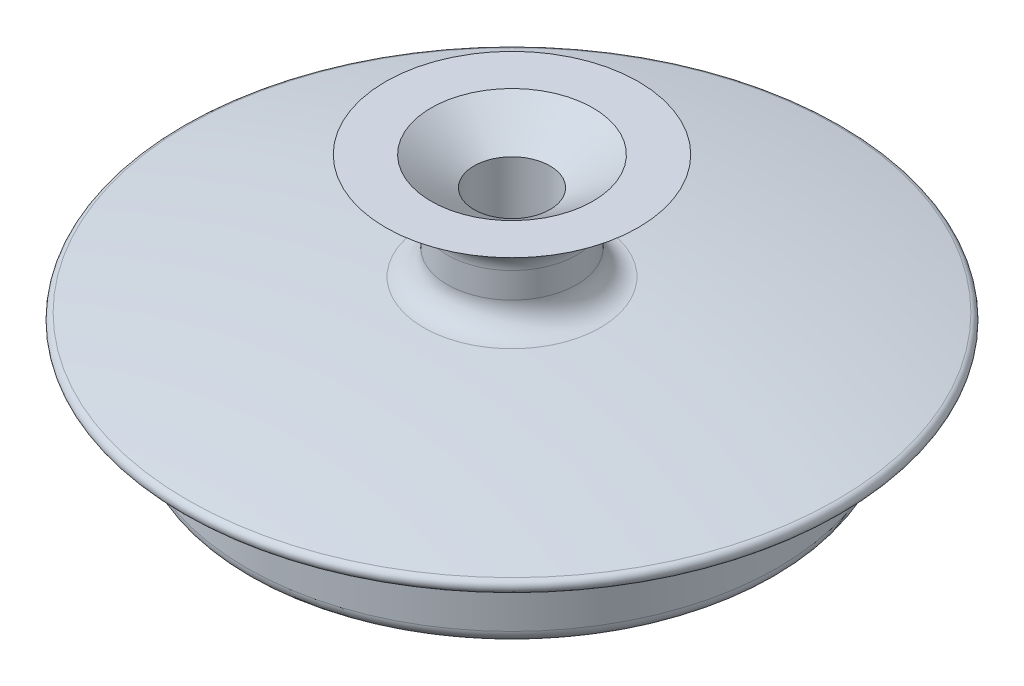
ISO-10303-21;
HEADER;
FILE_DESCRIPTION(('STEP AP214'),'2;1');
FILE_NAME('part.step','',(''),(''),'','','');
FILE_SCHEMA(('AUTOMOTIVE_DESIGN { 1 0 10303 214 1 1 1 1 }'));
ENDSEC;
DATA;
#1=APPLICATION_CONTEXT('core data for automotive mechanical design processes');
#2=APPLICATION_PROTOCOL_DEFINITION('international standard','automotive_design',2000,#1);
#3=PRODUCT_CONTEXT('',#1,'mechanical');
#4=PRODUCT('Part','Part','',(#3));
#5=PRODUCT_RELATED_PRODUCT_CATEGORY('part','',(#4));
#6=PRODUCT_DEFINITION_FORMATION('','',#4);
#7=PRODUCT_DEFINITION_CONTEXT('part definition',#1,'design');
#8=PRODUCT_DEFINITION('design','',#6,#7);
#9=PRODUCT_DEFINITION_SHAPE('','',#8);
#10=(LENGTH_UNIT() NAMED_UNIT(*) SI_UNIT(.MILLI.,.METRE.));
#11=(NAMED_UNIT(*) PLANE_ANGLE_UNIT() SI_UNIT($,.RADIAN.));
#12=(NAMED_UNIT(*) SI_UNIT($,.STERADIAN.) SOLID_ANGLE_UNIT());
#13=UNCERTAINTY_MEASURE_WITH_UNIT(LENGTH_MEASURE(1.E-05),#10,'distance_accuracy_value','');
#14=(GEOMETRIC_REPRESENTATION_CONTEXT(3) GLOBAL_UNCERTAINTY_ASSIGNED_CONTEXT((#13)) GLOBAL_UNIT_ASSIGNED_CONTEXT((#10,
#11,#12)) REPRESENTATION_CONTEXT('',''));
#15=CARTESIAN_POINT('',(0.,0.,0.));
#16=DIRECTION('',(0.,0.,1.));
#17=DIRECTION('',(1.,0.,0.));
#18=AXIS2_PLACEMENT_3D('',#15,#16,#17);
#19=CARTESIAN_POINT('',(0.,-123.168201963395,0.));
#20=DIRECTION('',(0.,-1.,0.));
#21=DIRECTION('',(-1.,0.,0.));
#22=AXIS2_PLACEMENT_3D('',#19,#20,#21);
#23=SPHERICAL_SURFACE('',#22,125.);
#24=CARTESIAN_POINT('',(-4.28109940677359E-13,1.63613172095924,0.));
#25=DIRECTION('',(0.,-1.,0.));
#26=DIRECTION('',(1.,0.,0.));
#27=AXIS2_PLACEMENT_3D('',#24,#25,#26);
#28=CIRCLE('',#27,6.99130128119908);
#29=CARTESIAN_POINT('',(-6.99130128119916,1.63613172095921,0.));
#30=VERTEX_POINT('',#29);
#31=EDGE_CURVE('E10',#30,#30,#28,.T.);
#32=CARTESIAN_POINT('',(-4.19642786529738E-13,-0.832247149020998,0.));
#33=DIRECTION('',(0.,-1.,0.));
#34=DIRECTION('',(1.,0.,0.));
#35=AXIS2_PLACEMENT_3D('',#32,#33,#34);
#36=CIRCLE('',#35,25.6693233190041);
#37=CARTESIAN_POINT('',(-25.6693233190046,-0.832247149021095,0.));
#38=VERTEX_POINT('',#37);
#39=EDGE_CURVE('E59',#38,#38,#36,.F.);
#40=CARTESIAN_POINT('',(-6.99130128119916,1.63613172095921,0.));
#41=CARTESIAN_POINT('',(-7.18743439887185,1.62514472063349,0.));
#42=CARTESIAN_POINT('',(-7.38354161658286,1.61369537094568,0.));
#43=CARTESIAN_POINT('',(-7.77569989415684,1.5898722435378,0.));
#44=CARTESIAN_POINT('',(-7.9717509540198,1.57749846581773,0.));
#45=CARTESIAN_POINT('',(-8.36379255797304,1.55182675303725,0.));
#46=CARTESIAN_POINT('',(-8.55978310206332,1.53852881797685,0.));
#47=CARTESIAN_POINT('',(-8.95169931822605,1.51100908725467,0.));
#48=CARTESIAN_POINT('',(-9.14762499029852,1.49678729159291,0.));
#49=CARTESIAN_POINT('',(-9.53940710753282,1.46742015546659,0.));
#50=CARTESIAN_POINT('',(-9.73526355269466,1.45227481500205,0.));
#51=CARTESIAN_POINT('',(-10.1269028627777,1.42106092599181,0.));
#52=CARTESIAN_POINT('',(-10.3226857276988,1.40499237744611,0.));
#53=CARTESIAN_POINT('',(-10.7141735255994,1.3719324294096,0.));
#54=CARTESIAN_POINT('',(-10.9098784585789,1.35494102991879,0.));
#55=CARTESIAN_POINT('',(-11.3012060426289,1.32003575766884,0.));
#56=CARTESIAN_POINT('',(-11.4968286936995,1.3021218849097,0.));
#57=CARTESIAN_POINT('',(-11.8879873657933,1.26537206429622,0.));
#58=CARTESIAN_POINT('',(-12.0835233868164,1.24653611644188,0.));
#59=CARTESIAN_POINT('',(-12.4745044526022,1.20794256430833,0.));
#60=CARTESIAN_POINT('',(-12.6699494973649,1.18818496002912,0.));
#61=CARTESIAN_POINT('',(-13.0607442664388,1.14774853420138,0.));
#62=CARTESIAN_POINT('',(-13.2560939907501,1.12706971265286,0.));
#63=CARTESIAN_POINT('',(-13.6466937768492,1.0847913119183,0.));
#64=CARTESIAN_POINT('',(-13.8419438386369,1.06319173273227,0.));
#65=CARTESIAN_POINT('',(-14.2323399598319,1.01907229682025,0.));
#66=CARTESIAN_POINT('',(-14.4274860192391,0.996552440094265,0.));
#67=CARTESIAN_POINT('',(-14.8176697981278,0.950592949655117,0.));
#68=CARTESIAN_POINT('',(-15.0127075176093,0.927153315941957,0.));
#69=CARTESIAN_POINT('',(-15.4026702815092,0.879354792525263,0.));
#70=CARTESIAN_POINT('',(-15.5975953259276,0.854995902821729,0.));
#71=CARTESIAN_POINT('',(-15.9873284070689,0.805359408853541,0.));
#72=CARTESIAN_POINT('',(-16.1821364437916,0.780081804588888,0.));
#73=CARTESIAN_POINT('',(-16.5716311795094,0.728608443348151,0.));
#74=CARTESIAN_POINT('',(-16.7663178785044,0.702412686372069,0.));
#75=CARTESIAN_POINT('',(-17.1555656114318,0.649103601966116,0.));
#76=CARTESIAN_POINT('',(-17.3501266453641,0.621990274536246,0.));
#77=CARTESIAN_POINT('',(-17.7391187236242,0.566846651875337,0.));
#78=CARTESIAN_POINT('',(-17.933549767952,0.538816356644298,0.));
#79=CARTESIAN_POINT('',(-18.3222775453505,0.481839421415272,0.));
#80=CARTESIAN_POINT('',(-18.5165742784212,0.452892781417285,0.));
#81=CARTESIAN_POINT('',(-18.9050291146385,0.394083800056363,0.));
#82=CARTESIAN_POINT('',(-19.099187217785,0.364221458693429,0.));
#83=CARTESIAN_POINT('',(-19.487360478568,0.30358173835805,0.));
#84=CARTESIAN_POINT('',(-19.6813756362045,0.272804359385605,0.));
#85=CARTESIAN_POINT('',(-20.069258693559,0.210335247925313,0.));
#86=CARTESIAN_POINT('',(-20.2631265932769,0.178643515437466,0.));
#87=CARTESIAN_POINT('',(-20.6507108256589,0.114346401364108,0.));
#88=CARTESIAN_POINT('',(-20.8444271583229,0.0817410197785956,0.));
#89=CARTESIAN_POINT('',(-21.2317039508304,0.015617332234952,0.));
#90=CARTESIAN_POINT('',(-21.4252644106739,-0.0179009737231797,0.));
#91=CARTESIAN_POINT('',(-21.8122251552388,-0.0858497649932831,0.));
#92=CARTESIAN_POINT('',(-22.0056254399603,-0.120280250305255,0.));
#93=CARTESIAN_POINT('',(-22.3922615355382,-0.190052634996572,0.));
#94=CARTESIAN_POINT('',(-22.5854973463946,-0.225394534375918,0.));
#95=CARTESIAN_POINT('',(-22.9718001991613,-0.296988961629475,0.));
#96=CARTESIAN_POINT('',(-23.1648672410715,-0.333241489503686,0.));
#97=CARTESIAN_POINT('',(-23.5508282645942,-0.406656368037758,0.));
#98=CARTESIAN_POINT('',(-23.7437222462067,-0.443818718697619,0.));
#99=CARTESIAN_POINT('',(-24.1293328617088,-0.519052416483002,0.));
#100=CARTESIAN_POINT('',(-24.3220494955983,-0.557123763608525,0.));
#101=CARTESIAN_POINT('',(-24.7073011318745,-0.634174609248697,0.));
#102=CARTESIAN_POINT('',(-24.899836134261,-0.673154107763346,0.));
#103=CARTESIAN_POINT('',(-25.2847202288957,-0.752020385516074,0.));
#104=CARTESIAN_POINT('',(-25.4770693211437,-0.791907164754153,0.));
#105=CARTESIAN_POINT('',(-25.6693233190046,-0.832247149021095,0.));
#106=B_SPLINE_CURVE_WITH_KNOTS('',3,(#40,#41,#42,#43,#44,#45,#46,#47,#48,#49,#50,#51,#52,#53,
#54,#55,#56,#57,#58,#59,#60,#61,#62,#63,#64,#65,#66,#67,#68,#69,#70,#71,#72,#73,#74,#75,#76,#77,
#78,#79,#80,#81,#82,#83,#84,#85,#86,#87,#88,#89,#90,#91,#92,#93,#94,#95,#96,#97,#98,#99,#100,
#101,#102,#103,#104,#105),.UNSPECIFIED.,.F.,.F.,(4,2,2,2,2,2,2,2,2,2,2,2,2,2,2,2,2,2,2,2,2,2,2,
2,2,2,2,2,2,2,2,2,4),(0.,0.589321290015238,1.17864258003045,1.76796387004569,2.35728516006093,
2.94660645007614,3.53592774009138,4.12524903010662,4.71457032012186,5.30389161013707,
5.89321290015231,6.48253419016755,7.07185548018276,7.661176770198,8.25049806021324,
8.83981935022846,9.42914064024369,10.0184619302589,10.6077832202741,11.1971045102894,
11.7864258003046,12.3757470903198,12.9650683803351,13.5543896703503,14.1437109603655,
14.7330322503808,15.322353540396,15.9116748304112,16.5009961204265,17.0903174104417,
17.6796387004569,18.2689599904721,18.8582812804874),.UNSPECIFIED.);
#107=EDGE_CURVE('BSEAM39',#30,#38,#106,.T.);
#108=ORIENTED_EDGE('',*,*,#31,.T.);
#109=ORIENTED_EDGE('',*,*,#39,.T.);
#110=ORIENTED_EDGE('',*,*,#107,.T.);
#111=ORIENTED_EDGE('',*,*,#107,.F.);
#112=EDGE_LOOP('',(#108,#110,#109,#111));
#113=FACE_BOUND('',#112,.T.);
#114=ADVANCED_FACE('F39',(#113),#23,.T.);
#115=CARTESIAN_POINT('',(-30.,-1.82159096827858,0.));
#116=DIRECTION('',(0.,1.,0.));
#117=DIRECTION('',(-1.,0.,0.));
#118=AXIS2_PLACEMENT_3D('',#115,#116,#117);
#119=PLANE('',#118);
#120=CARTESIAN_POINT('',(-4.16249090884177E-13,-1.82159096827847,0.));
#121=DIRECTION('',(0.,1.,0.));
#122=DIRECTION('',(-1.,0.,0.));
#123=AXIS2_PLACEMENT_3D('',#120,#121,#122);
#124=CIRCLE('',#123,25.5666460257281);
#125=CARTESIAN_POINT('',(-25.5666460257285,-1.82159096827856,0.));
#126=VERTEX_POINT('',#125);
#127=EDGE_CURVE('E62',#126,#126,#124,.F.);
#128=ORIENTED_EDGE('',*,*,#127,.T.);
#129=EDGE_LOOP('',(#128));
#130=FACE_BOUND('',#129,.T.);
#131=CARTESIAN_POINT('',(0.,-1.8215909682785,0.));
#132=DIRECTION('',(0.,-1.,0.));
#133=DIRECTION('',(1.,0.,0.));
#134=AXIS2_PLACEMENT_3D('',#131,#132,#133);
#135=CIRCLE('',#134,21.);
#136=CARTESIAN_POINT('',(21.,-1.82159096827843,0.));
#137=VERTEX_POINT('',#136);
#138=EDGE_CURVE('E65',#137,#137,#135,.T.);
#139=ORIENTED_EDGE('',*,*,#138,.F.);
#140=EDGE_LOOP('',(#139));
#141=FACE_BOUND('',#140,.T.);
#142=ADVANCED_FACE('F131',(#130,#141),#119,.F.);
#143=CARTESIAN_POINT('',(2.98951458464859E-12,-871.51532895124,0.));
#144=DIRECTION('',(0.,-1.,0.));
#145=DIRECTION('',(1.,0.,0.));
#146=AXIS2_PLACEMENT_3D('',#143,#144,#145);
#147=CYLINDRICAL_SURFACE('',#146,21.);
#148=CARTESIAN_POINT('',(0.,-7.8215909682785,0.));
#149=DIRECTION('',(0.,-1.,0.));
#150=DIRECTION('',(1.,0.,0.));
#151=AXIS2_PLACEMENT_3D('',#148,#149,#150);
#152=CIRCLE('',#151,21.);
#153=CARTESIAN_POINT('',(21.0000000000001,-7.82159096827843,0.));
#154=VERTEX_POINT('',#153);
#155=EDGE_CURVE('E68',#154,#154,#152,.T.);
#156=ORIENTED_EDGE('',*,*,#155,.F.);
#157=EDGE_LOOP('',(#156));
#158=FACE_BOUND('',#157,.T.);
#159=ORIENTED_EDGE('',*,*,#138,.T.);
#160=EDGE_LOOP('',(#159));
#161=FACE_BOUND('',#160,.T.);
#162=ADVANCED_FACE('F125',(#158,#161),#147,.T.);
#163=CARTESIAN_POINT('',(0.,-7.82159096827845,0.));
#164=DIRECTION('',(0.,-1.,0.));
#165=DIRECTION('',(1.,0.,0.));
#166=AXIS2_PLACEMENT_3D('',#163,#164,#165);
#167=TOROIDAL_SURFACE('',#166,20.,0.999999999999999);
#168=CARTESIAN_POINT('',(0.,-7.8215909682785,0.));
#169=DIRECTION('',(0.,-1.,0.));
#170=DIRECTION('',(1.,0.,0.));
#171=AXIS2_PLACEMENT_3D('',#168,#169,#170);
#172=CIRCLE('',#171,19.);
#173=CARTESIAN_POINT('',(19.0000000000001,-7.82159096827844,0.));
#174=VERTEX_POINT('',#173);
#175=EDGE_CURVE('E71',#174,#174,#172,.T.);
#176=ORIENTED_EDGE('',*,*,#175,.F.);
#177=EDGE_LOOP('',(#176));
#178=FACE_BOUND('',#177,.T.);
#179=ORIENTED_EDGE('',*,*,#155,.T.);
#180=EDGE_LOOP('',(#179));
#181=FACE_BOUND('',#180,.T.);
#182=ADVANCED_FACE('F119',(#178,#181),#167,.T.);
#183=CARTESIAN_POINT('',(2.98951458464859E-12,-871.51532895124,0.));
#184=DIRECTION('',(0.,-1.,0.));
#185=DIRECTION('',(1.,0.,0.));
#186=AXIS2_PLACEMENT_3D('',#183,#184,#185);
#187=CYLINDRICAL_SURFACE('',#186,19.);
#188=CARTESIAN_POINT('',(0.,-1.8215909682785,0.));
#189=DIRECTION('',(0.,-1.,0.));
#190=DIRECTION('',(1.,0.,0.));
#191=AXIS2_PLACEMENT_3D('',#188,#189,#190);
#192=CIRCLE('',#191,19.);
#193=CARTESIAN_POINT('',(-18.9999999999999,-1.82159096827857,0.));
#194=VERTEX_POINT('',#193);
#195=EDGE_CURVE('E74',#194,#194,#192,.T.);
#196=ORIENTED_EDGE('',*,*,#195,.F.);
#197=EDGE_LOOP('',(#196));
#198=FACE_BOUND('',#197,.T.);
#199=ORIENTED_EDGE('',*,*,#175,.T.);
#200=EDGE_LOOP('',(#199));
#201=FACE_BOUND('',#200,.T.);
#202=ADVANCED_FACE('F113',(#198,#201),#187,.F.);
#203=CARTESIAN_POINT('',(0.,-100.,0.));
#204=DIRECTION('',(0.,-1.,0.));
#205=DIRECTION('',(-1.,0.,0.));
#206=AXIS2_PLACEMENT_3D('',#203,#204,#205);
#207=SPHERICAL_SURFACE('',#206,100.);
#208=CARTESIAN_POINT('',(0.,-0.0450101295588201,0.));
#209=DIRECTION('',(0.,-1.,0.));
#210=DIRECTION('',(1.,0.,0.));
#211=AXIS2_PLACEMENT_3D('',#208,#209,#210);
#212=CIRCLE('',#211,2.99999999999999);
#213=CARTESIAN_POINT('',(-3.00000000000035,-0.045010129558834,0.));
#214=VERTEX_POINT('',#213);
#215=EDGE_CURVE('E77',#214,#214,#212,.T.);
#216=CARTESIAN_POINT('',(-3.00000000000035,-0.045010129558834,0.));
#217=CARTESIAN_POINT('',(-3.16779698705432,-0.0500463021080371,0.));
#218=CARTESIAN_POINT('',(-3.33558129231152,-0.0555050098275396,0.));
#219=CARTESIAN_POINT('',(-3.67112028430825,-0.0672673402568317,0.));
#220=CARTESIAN_POINT('',(-3.83887497104779,-0.0735709629666213,0.));
#221=CARTESIAN_POINT('',(-4.17435047108516,-0.087022968026176,0.));
#222=CARTESIAN_POINT('',(-4.34207128438298,-0.094171350375941,0.));
#223=CARTESIAN_POINT('',(-4.67747478367325,-0.10931269219748,0.));
#224=CARTESIAN_POINT('',(-4.84515746966569,-0.117305651669254,0.));
#225=CARTESIAN_POINT('',(-5.18048046139465,-0.134135945334323,0.));
#226=CARTESIAN_POINT('',(-5.34812076713116,-0.142973279527619,0.));
#227=CARTESIAN_POINT('',(-5.68335474648701,-0.161492098407179,0.));
#228=CARTESIAN_POINT('',(-5.85094842010636,-0.171173583093444,0.));
#229=CARTESIAN_POINT('',(-6.18608488454553,-0.191380457430572,0.));
#230=CARTESIAN_POINT('',(-6.35362767536535,-0.201905847081434,0.));
#231=CARTESIAN_POINT('',(-6.68865812481469,-0.223800264385871,0.));
#232=CARTESIAN_POINT('',(-6.85614578344421,-0.235169292039445,0.));
#233=CARTESIAN_POINT('',(-7.19106172052018,-0.258750696998082,0.));
#234=CARTESIAN_POINT('',(-7.35848999896664,-0.270963074303146,0.));
#235=CARTESIAN_POINT('',(-7.69328292918991,-0.296230868821594,0.));
#236=CARTESIAN_POINT('',(-7.86064758096672,-0.309286286034978,0.));
#237=CARTESIAN_POINT('',(-8.19530901297781,-0.33623982924537,0.));
#238=CARTESIAN_POINT('',(-8.3626057932121,-0.350137955242376,0.));
#239=CARTESIAN_POINT('',(-8.69712723898673,-0.378776563521542,0.));
#240=CARTESIAN_POINT('',(-8.86435190452706,-0.393517045803701,0.));
#241=CARTESIAN_POINT('',(-9.1987248795914,-0.423839992790057,0.));
#242=CARTESIAN_POINT('',(-9.3658731891154,-0.439422457494254,0.));
#243=CARTESIAN_POINT('',(-9.70008921276129,-0.471428974106325,0.));
#244=CARTESIAN_POINT('',(-9.86715692688319,-0.487853026014198,0.));
#245=CARTESIAN_POINT('',(-10.2012075223833,-0.521542300470082,0.));
#246=CARTESIAN_POINT('',(-10.3681904037614,-0.538807523018092,0.));
#247=CARTESIAN_POINT('',(-10.702067098584,-0.574178700856088,0.));
#248=CARTESIAN_POINT('',(-10.8689609120285,-0.592284656146075,0.));
#249=CARTESIAN_POINT('',(-11.2026552380526,-0.629336840246331,0.));
#250=CARTESIAN_POINT('',(-11.3694557506323,-0.6482830690566,0.));
#251=CARTESIAN_POINT('',(-11.7029592443625,-0.687015319663857,0.));
#252=CARTESIAN_POINT('',(-11.8696622255129,-0.706801341460844,0.));
#253=CARTESIAN_POINT('',(-12.2029664282935,-0.747212676208275,0.));
#254=CARTESIAN_POINT('',(-12.3695676499238,-0.767837989158719,0.));
#255=CARTESIAN_POINT('',(-12.7026641081541,-0.80992738309288,0.));
#256=CARTESIAN_POINT('',(-12.8691593447541,-0.831391464076598,0.));
#257=CARTESIAN_POINT('',(-13.2020396101022,-0.875157849683394,0.));
#258=CARTESIAN_POINT('',(-13.3684246388503,-0.897460154306472,0.));
#259=CARTESIAN_POINT('',(-13.7010802684677,-0.942902421538218,0.));
#260=CARTESIAN_POINT('',(-13.867350869337,-0.966042384146885,0.));
#261=CARTESIAN_POINT('',(-14.1997734260726,-1.01315938045051,0.));
#262=CARTESIAN_POINT('',(-14.3659253819389,-1.03713641414548,0.));
#263=CARTESIAN_POINT('',(-14.698106434553,-1.08592694449162,0.));
#264=CARTESIAN_POINT('',(-14.864135531301,-1.11074044114281,0.));
#265=CARTESIAN_POINT('',(-15.1960666546792,-1.16120326805664,0.));
#266=CARTESIAN_POINT('',(-15.3619686813096,-1.1868525983193,0.));
#267=CARTESIAN_POINT('',(-15.6936414566768,-1.23898644190998,0.));
#268=CARTESIAN_POINT('',(-15.8594122054137,-1.265470955238,0.));
#269=CARTESIAN_POINT('',(-16.190818220546,-1.31927449323834,0.));
#270=CARTESIAN_POINT('',(-16.3564534869415,-1.34659351791067,0.));
#271=CARTESIAN_POINT('',(-16.6875843363851,-1.40206538568371,0.));
#272=CARTESIAN_POINT('',(-16.8530799194332,-1.43021822878443,0.));
#273=CARTESIAN_POINT('',(-17.1839272046981,-1.48735701945886,0.));
#274=CARTESIAN_POINT('',(-17.349278906915,-1.51634296703257,0.));
#275=CARTESIAN_POINT('',(-17.6798342367593,-1.57514723116209,0.));
#276=CARTESIAN_POINT('',(-17.8450378643868,-1.60496554771791,0.));
#277=CARTESIAN_POINT('',(-18.1752928547649,-1.66543379472234,0.));
#278=CARTESIAN_POINT('',(-18.3403442175156,-1.69608372517095,0.));
#279=CARTESIAN_POINT('',(-18.6702904927777,-1.75821441813306,0.));
#280=CARTESIAN_POINT('',(-18.8351854052892,-1.78969518064656,0.));
#281=CARTESIAN_POINT('',(-18.9999999999999,-1.82159096827857,0.));
#282=B_SPLINE_CURVE_WITH_KNOTS('',3,(#216,#217,#218,#219,#220,#221,#222,#223,#224,#225,#226,
#227,#228,#229,#230,#231,#232,#233,#234,#235,#236,#237,#238,#239,#240,#241,#242,#243,#244,#245,
#246,#247,#248,#249,#250,#251,#252,#253,#254,#255,#256,#257,#258,#259,#260,#261,#262,#263,#264,
#265,#266,#267,#268,#269,#270,#271,#272,#273,#274,#275,#276,#277,#278,#279,#280,#281),
.UNSPECIFIED.,.F.,.F.,(4,2,2,2,2,2,2,2,2,2,2,2,2,2,2,2,2,2,2,2,2,2,2,2,2,2,2,2,2,2,2,2,4),(0.,
0.503617107490903,1.00723421498181,1.51085132247271,2.01446842996361,2.51808553745452,
3.02170264494542,3.52531975243632,4.02893685992723,4.5325539674181,5.03617107490901,
5.53978818239991,6.04340528989081,6.54702239738172,7.05063950487262,7.55425661236352,
8.05787371985443,8.56149082734533,9.06510793483623,9.56872504232713,10.072342149818,
10.5759592573089,11.0795763647998,11.5831934722907,12.0868105797816,12.5904276872726,
13.0940447947634,13.5976619022543,14.1012790097452,14.6048961172361,15.108513224727,
15.6121303322179,16.1157474397089),.UNSPECIFIED.);
#283=EDGE_CURVE('BSEAM107',#214,#194,#282,.T.);
#284=ORIENTED_EDGE('',*,*,#215,.F.);
#285=ORIENTED_EDGE('',*,*,#195,.T.);
#286=ORIENTED_EDGE('',*,*,#283,.T.);
#287=ORIENTED_EDGE('',*,*,#283,.F.);
#288=EDGE_LOOP('',(#284,#286,#285,#287));
#289=FACE_BOUND('',#288,.T.);
#290=ADVANCED_FACE('F107',(#289),#207,.F.);
#291=CARTESIAN_POINT('',(2.98951458464859E-12,-871.51532895124,0.));
#292=DIRECTION('',(0.,-1.,0.));
#293=DIRECTION('',(1.,0.,0.));
#294=AXIS2_PLACEMENT_3D('',#291,#292,#293);
#295=CYLINDRICAL_SURFACE('',#294,2.99999999999998);
#296=CARTESIAN_POINT('',(0.,7.72758554188446,0.));
#297=DIRECTION('',(0.,-1.,0.));
#298=DIRECTION('',(1.,0.,0.));
#299=AXIS2_PLACEMENT_3D('',#296,#297,#298);
#300=CIRCLE('',#299,2.99999999999997);
#301=CARTESIAN_POINT('',(2.99999999999995,7.72758554188447,0.));
#302=VERTEX_POINT('',#301);
#303=EDGE_CURVE('E80',#302,#302,#300,.T.);
#304=ORIENTED_EDGE('',*,*,#303,.F.);
#305=EDGE_LOOP('',(#304));
#306=FACE_BOUND('',#305,.T.);
#307=ORIENTED_EDGE('',*,*,#215,.T.);
#308=EDGE_LOOP('',(#307));
#309=FACE_BOUND('',#308,.T.);
#310=ADVANCED_FACE('F101',(#306,#309),#295,.F.);
#311=CARTESIAN_POINT('',(0.,7.72758554188446,0.));
#312=DIRECTION('',(0.,1.,0.));
#313=DIRECTION('',(-1.,0.,0.));
#314=AXIS2_PLACEMENT_3D('',#311,#312,#313);
#315=CONICAL_SURFACE('',#314,2.99999999999997,0.98168389570653);
#316=CARTESIAN_POINT('',(0.,10.,0.));
#317=DIRECTION('',(0.,-1.,0.));
#318=DIRECTION('',(1.,0.,0.));
#319=AXIS2_PLACEMENT_3D('',#316,#317,#318);
#320=CIRCLE('',#319,6.40043884464303);
#321=CARTESIAN_POINT('',(6.400438844643,10.,0.));
#322=VERTEX_POINT('',#321);
#323=EDGE_CURVE('E83',#322,#322,#320,.T.);
#324=ORIENTED_EDGE('',*,*,#323,.F.);
#325=EDGE_LOOP('',(#324));
#326=FACE_BOUND('',#325,.T.);
#327=ORIENTED_EDGE('',*,*,#303,.T.);
#328=EDGE_LOOP('',(#327));
#329=FACE_BOUND('',#328,.T.);
#330=ADVANCED_FACE('F95',(#326,#329),#315,.F.);
#331=CARTESIAN_POINT('',(-10.,9.99999999999999,0.));
#332=DIRECTION('',(0.,-1.,0.));
#333=DIRECTION('',(1.,0.,0.));
#334=AXIS2_PLACEMENT_3D('',#331,#332,#333);
#335=PLANE('',#334);
#336=CARTESIAN_POINT('',(0.,10.,0.));
#337=DIRECTION('',(0.,-1.,0.));
#338=DIRECTION('',(1.,0.,0.));
#339=AXIS2_PLACEMENT_3D('',#336,#337,#338);
#340=CIRCLE('',#339,9.99999999999997);
#341=CARTESIAN_POINT('',(9.99999999999993,10.,0.));
#342=VERTEX_POINT('',#341);
#343=EDGE_CURVE('E86',#342,#342,#340,.T.);
#344=ORIENTED_EDGE('',*,*,#343,.F.);
#345=EDGE_LOOP('',(#344));
#346=FACE_BOUND('',#345,.T.);
#347=ORIENTED_EDGE('',*,*,#323,.T.);
#348=EDGE_LOOP('',(#347));
#349=FACE_BOUND('',#348,.T.);
#350=ADVANCED_FACE('F92',(#346,#349),#335,.F.);
#351=CARTESIAN_POINT('',(0.,10.,0.));
#352=DIRECTION('',(0.,1.,0.));
#353=DIRECTION('',(-1.,0.,0.));
#354=AXIS2_PLACEMENT_3D('',#351,#352,#353);
#355=CONICAL_SURFACE('',#354,9.99999999999997,0.981683895706582);
#356=CARTESIAN_POINT('',(0.,7.32151362833021,0.));
#357=DIRECTION('',(0.,1.,0.));
#358=DIRECTION('',(-1.,0.,0.));
#359=AXIS2_PLACEMENT_3D('',#356,#357,#358);
#360=CIRCLE('',#359,5.99191552819674);
#361=CARTESIAN_POINT('',(-5.99191552819677,7.32151362833019,0.));
#362=VERTEX_POINT('',#361);
#363=EDGE_CURVE('E46',#362,#362,#360,.T.);
#364=ORIENTED_EDGE('',*,*,#363,.T.);
#365=EDGE_LOOP('',(#364));
#366=FACE_BOUND('',#365,.T.);
#367=ORIENTED_EDGE('',*,*,#343,.T.);
#368=EDGE_LOOP('',(#367));
#369=FACE_BOUND('',#368,.T.);
#370=ADVANCED_FACE('F90',(#366,#369),#355,.T.);
#371=CARTESIAN_POINT('',(2.98951458464859E-12,-871.51532895124,0.));
#372=DIRECTION('',(0.,-1.,0.));
#373=DIRECTION('',(1.,0.,0.));
#374=AXIS2_PLACEMENT_3D('',#371,#372,#373);
#375=CYLINDRICAL_SURFACE('',#374,5.10316210169827);
#376=CARTESIAN_POINT('',(0.,5.6586453073616,0.));
#377=DIRECTION('',(0.,-1.,0.));
#378=DIRECTION('',(1.,0.,0.));
#379=AXIS2_PLACEMENT_3D('',#376,#377,#378);
#380=CIRCLE('',#379,5.10316210169827);
#381=CARTESIAN_POINT('',(5.10316210169825,5.65864530736162,0.));
#382=VERTEX_POINT('',#381);
#383=EDGE_CURVE('E50',#382,#382,#380,.T.);
#384=ORIENTED_EDGE('',*,*,#383,.T.);
#385=EDGE_LOOP('',(#384));
#386=FACE_BOUND('',#385,.T.);
#387=CARTESIAN_POINT('',(0.,3.63300105990894,0.));
#388=DIRECTION('',(0.,-1.,0.));
#389=DIRECTION('',(1.,0.,0.));
#390=AXIS2_PLACEMENT_3D('',#387,#388,#389);
#391=CIRCLE('',#390,5.10316210169827);
#392=CARTESIAN_POINT('',(5.10316210169826,3.63300105990895,0.));
#393=VERTEX_POINT('',#392);
#394=EDGE_CURVE('E54',#393,#393,#391,.F.);
#395=ORIENTED_EDGE('',*,*,#394,.T.);
#396=EDGE_LOOP('',(#395));
#397=FACE_BOUND('',#396,.T.);
#398=ADVANCED_FACE('F146',(#386,#397),#375,.T.);
#399=CARTESIAN_POINT('',(-4.1796421538362E-13,-1.32159096827848,0.));
#400=DIRECTION('',(0.,1.,0.));
#401=DIRECTION('',(-1.,0.,0.));
#402=AXIS2_PLACEMENT_3D('',#399,#400,#401);
#403=TOROIDAL_SURFACE('',#402,25.5666460257281,0.5);
#404=ORIENTED_EDGE('',*,*,#39,.F.);
#405=EDGE_LOOP('',(#404));
#406=FACE_BOUND('',#405,.T.);
#407=ORIENTED_EDGE('',*,*,#127,.F.);
#408=EDGE_LOOP('',(#407));
#409=FACE_BOUND('',#408,.T.);
#410=ADVANCED_FACE('F143',(#406,#409),#403,.T.);
#411=CARTESIAN_POINT('',(0.,5.65864530736154,0.));
#412=DIRECTION('',(0.,-1.,0.));
#413=DIRECTION('',(1.,0.,0.));
#414=AXIS2_PLACEMENT_3D('',#411,#412,#413);
#415=TOROIDAL_SURFACE('',#414,7.10316210169827,2.);
#416=ORIENTED_EDGE('',*,*,#363,.F.);
#417=EDGE_LOOP('',(#416));
#418=FACE_BOUND('',#417,.T.);
#419=ORIENTED_EDGE('',*,*,#383,.F.);
#420=EDGE_LOOP('',(#419));
#421=FACE_BOUND('',#420,.T.);
#422=ADVANCED_FACE('F145',(#418,#421),#415,.F.);
#423=CARTESIAN_POINT('',(0.,3.63300105990891,0.));
#424=DIRECTION('',(0.,-1.,0.));
#425=DIRECTION('',(1.,0.,0.));
#426=AXIS2_PLACEMENT_3D('',#423,#424,#425);
#427=TOROIDAL_SURFACE('',#426,7.10316210169827,2.);
#428=ORIENTED_EDGE('',*,*,#394,.F.);
#429=EDGE_LOOP('',(#428));
#430=FACE_BOUND('',#429,.T.);
#431=ORIENTED_EDGE('',*,*,#31,.F.);
#432=EDGE_LOOP('',(#431));
#433=FACE_BOUND('',#432,.T.);
#434=ADVANCED_FACE('F41',(#430,#433),#427,.F.);
#435=CLOSED_SHELL('',(#114,#142,#162,#182,#202,#290,#310,#330,#350,#370,#398,#410,#422,#434));
#436=MANIFOLD_SOLID_BREP('B2',#435);
#437=ADVANCED_BREP_SHAPE_REPRESENTATION('',(#18,#436),#14);
#438=SHAPE_DEFINITION_REPRESENTATION(#9,#437);
ENDSEC;
END-ISO-10303-21;
